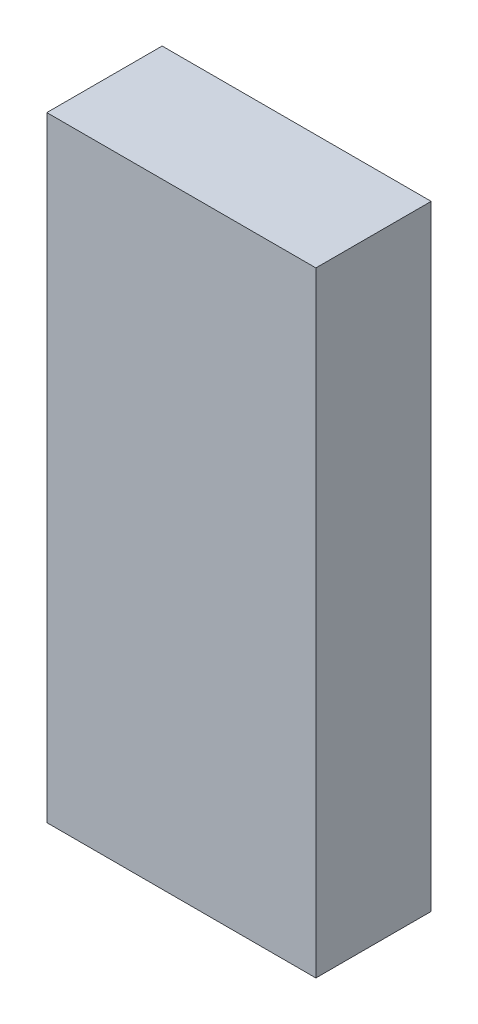
ISO-10303-21;
HEADER;
FILE_DESCRIPTION(('STEP AP214'),'2;1');
FILE_NAME('part.step','',(''),(''),'','','');
FILE_SCHEMA(('AUTOMOTIVE_DESIGN { 1 0 10303 214 1 1 1 1 }'));
ENDSEC;
DATA;
#1=APPLICATION_CONTEXT('core data for automotive mechanical design processes');
#2=APPLICATION_PROTOCOL_DEFINITION('international standard','automotive_design',2000,#1);
#3=PRODUCT_CONTEXT('',#1,'mechanical');
#4=PRODUCT('Part','Part','',(#3));
#5=PRODUCT_RELATED_PRODUCT_CATEGORY('part','',(#4));
#6=PRODUCT_DEFINITION_FORMATION('','',#4);
#7=PRODUCT_DEFINITION_CONTEXT('part definition',#1,'design');
#8=PRODUCT_DEFINITION('design','',#6,#7);
#9=PRODUCT_DEFINITION_SHAPE('','',#8);
#10=(LENGTH_UNIT() NAMED_UNIT(*) SI_UNIT(.MILLI.,.METRE.));
#11=(NAMED_UNIT(*) PLANE_ANGLE_UNIT() SI_UNIT($,.RADIAN.));
#12=(NAMED_UNIT(*) SI_UNIT($,.STERADIAN.) SOLID_ANGLE_UNIT());
#13=UNCERTAINTY_MEASURE_WITH_UNIT(LENGTH_MEASURE(1.E-05),#10,'distance_accuracy_value','');
#14=(GEOMETRIC_REPRESENTATION_CONTEXT(3) GLOBAL_UNCERTAINTY_ASSIGNED_CONTEXT((#13)) GLOBAL_UNIT_ASSIGNED_CONTEXT((#10,
#11,#12)) REPRESENTATION_CONTEXT('',''));
#15=CARTESIAN_POINT('',(0.,0.,0.));
#16=DIRECTION('',(0.,0.,1.));
#17=DIRECTION('',(1.,0.,0.));
#18=AXIS2_PLACEMENT_3D('',#15,#16,#17);
#19=CARTESIAN_POINT('',(0.,203.2,0.));
#20=DIRECTION('',(1.,0.,0.));
#21=DIRECTION('',(0.,0.,-1.));
#22=AXIS2_PLACEMENT_3D('',#19,#20,#21);
#23=PLANE('',#22);
#24=DIRECTION('',(0.,0.,1.));
#25=VECTOR('',#24,1.);
#26=CARTESIAN_POINT('',(0.,0.,0.));
#27=LINE('',#26,#25);
#28=CARTESIAN_POINT('',(0.,0.,-38.1));
#29=VERTEX_POINT('',#28);
#30=CARTESIAN_POINT('',(0.,0.,0.));
#31=VERTEX_POINT('',#30);
#32=EDGE_CURVE('E96',#29,#31,#27,.T.);
#33=ORIENTED_EDGE('',*,*,#32,.T.);
#34=DIRECTION('',(0.,-1.,0.));
#35=VECTOR('',#34,1.);
#36=CARTESIAN_POINT('',(0.,203.2,0.));
#37=LINE('',#36,#35);
#38=CARTESIAN_POINT('',(0.,203.2,0.));
#39=VERTEX_POINT('',#38);
#40=EDGE_CURVE('E11',#39,#31,#37,.T.);
#41=ORIENTED_EDGE('',*,*,#40,.F.);
#42=DIRECTION('',(0.,0.,1.));
#43=VECTOR('',#42,1.);
#44=CARTESIAN_POINT('',(0.,203.2,0.));
#45=LINE('',#44,#43);
#46=CARTESIAN_POINT('',(0.,203.2,-38.1));
#47=VERTEX_POINT('',#46);
#48=EDGE_CURVE('E84',#47,#39,#45,.T.);
#49=ORIENTED_EDGE('',*,*,#48,.F.);
#50=DIRECTION('',(0.,-1.,0.));
#51=VECTOR('',#50,1.);
#52=CARTESIAN_POINT('',(0.,203.2,-38.1));
#53=LINE('',#52,#51);
#54=EDGE_CURVE('E92',#47,#29,#53,.T.);
#55=ORIENTED_EDGE('',*,*,#54,.T.);
#56=EDGE_LOOP('',(#33,#41,#49,#55));
#57=FACE_BOUND('',#56,.T.);
#58=ADVANCED_FACE('F33',(#57),#23,.F.);
#59=CARTESIAN_POINT('',(0.,203.2,0.));
#60=DIRECTION('',(0.,0.,-1.));
#61=DIRECTION('',(-1.,0.,0.));
#62=AXIS2_PLACEMENT_3D('',#59,#60,#61);
#63=PLANE('',#62);
#64=DIRECTION('',(1.,0.,0.));
#65=VECTOR('',#64,1.);
#66=CARTESIAN_POINT('',(0.,0.,0.));
#67=LINE('',#66,#65);
#68=CARTESIAN_POINT('',(88.9,0.,0.));
#69=VERTEX_POINT('',#68);
#70=EDGE_CURVE('E88',#31,#69,#67,.T.);
#71=ORIENTED_EDGE('',*,*,#70,.T.);
#72=DIRECTION('',(0.,-1.,0.));
#73=VECTOR('',#72,1.);
#74=CARTESIAN_POINT('',(88.9,203.2,0.));
#75=LINE('',#74,#73);
#76=CARTESIAN_POINT('',(88.9,203.2,0.));
#77=VERTEX_POINT('',#76);
#78=EDGE_CURVE('E41',#77,#69,#75,.T.);
#79=ORIENTED_EDGE('',*,*,#78,.F.);
#80=DIRECTION('',(1.,0.,0.));
#81=VECTOR('',#80,1.);
#82=CARTESIAN_POINT('',(0.,203.2,0.));
#83=LINE('',#82,#81);
#84=EDGE_CURVE('E79',#39,#77,#83,.T.);
#85=ORIENTED_EDGE('',*,*,#84,.F.);
#86=ORIENTED_EDGE('',*,*,#40,.T.);
#87=EDGE_LOOP('',(#71,#79,#85,#86));
#88=FACE_BOUND('',#87,.T.);
#89=ADVANCED_FACE('F87',(#88),#63,.F.);
#90=CARTESIAN_POINT('',(88.9,203.2,0.));
#91=DIRECTION('',(-1.,0.,0.));
#92=DIRECTION('',(0.,0.,1.));
#93=AXIS2_PLACEMENT_3D('',#90,#91,#92);
#94=PLANE('',#93);
#95=DIRECTION('',(0.,0.,-1.));
#96=VECTOR('',#95,1.);
#97=CARTESIAN_POINT('',(88.9,0.,0.));
#98=LINE('',#97,#96);
#99=CARTESIAN_POINT('',(88.9,0.,-38.1));
#100=VERTEX_POINT('',#99);
#101=EDGE_CURVE('E66',#69,#100,#98,.T.);
#102=ORIENTED_EDGE('',*,*,#101,.T.);
#103=DIRECTION('',(0.,-1.,0.));
#104=VECTOR('',#103,1.);
#105=CARTESIAN_POINT('',(88.9,203.2,-38.1));
#106=LINE('',#105,#104);
#107=CARTESIAN_POINT('',(88.9,203.2,-38.1));
#108=VERTEX_POINT('',#107);
#109=EDGE_CURVE('E89',#108,#100,#106,.T.);
#110=ORIENTED_EDGE('',*,*,#109,.F.);
#111=DIRECTION('',(0.,0.,-1.));
#112=VECTOR('',#111,1.);
#113=CARTESIAN_POINT('',(88.9,203.2,0.));
#114=LINE('',#113,#112);
#115=EDGE_CURVE('E82',#77,#108,#114,.T.);
#116=ORIENTED_EDGE('',*,*,#115,.F.);
#117=ORIENTED_EDGE('',*,*,#78,.T.);
#118=EDGE_LOOP('',(#102,#110,#116,#117));
#119=FACE_BOUND('',#118,.T.);
#120=ADVANCED_FACE('F90',(#119),#94,.F.);
#121=CARTESIAN_POINT('',(0.,203.2,-38.1));
#122=DIRECTION('',(0.,0.,1.));
#123=DIRECTION('',(1.,0.,0.));
#124=AXIS2_PLACEMENT_3D('',#121,#122,#123);
#125=PLANE('',#124);
#126=DIRECTION('',(-1.,0.,0.));
#127=VECTOR('',#126,1.);
#128=CARTESIAN_POINT('',(0.,0.,-38.1));
#129=LINE('',#128,#127);
#130=EDGE_CURVE('E72',#100,#29,#129,.T.);
#131=ORIENTED_EDGE('',*,*,#130,.T.);
#132=ORIENTED_EDGE('',*,*,#54,.F.);
#133=DIRECTION('',(-1.,0.,0.));
#134=VECTOR('',#133,1.);
#135=CARTESIAN_POINT('',(0.,203.2,-38.1));
#136=LINE('',#135,#134);
#137=EDGE_CURVE('E49',#108,#47,#136,.T.);
#138=ORIENTED_EDGE('',*,*,#137,.F.);
#139=ORIENTED_EDGE('',*,*,#109,.T.);
#140=EDGE_LOOP('',(#131,#132,#138,#139));
#141=FACE_BOUND('',#140,.T.);
#142=ADVANCED_FACE('F103',(#141),#125,.F.);
#143=CARTESIAN_POINT('',(0.,203.2,0.));
#144=DIRECTION('',(0.,-1.,0.));
#145=DIRECTION('',(0.,0.,-1.));
#146=AXIS2_PLACEMENT_3D('',#143,#144,#145);
#147=PLANE('',#146);
#148=ORIENTED_EDGE('',*,*,#48,.T.);
#149=ORIENTED_EDGE('',*,*,#84,.T.);
#150=ORIENTED_EDGE('',*,*,#115,.T.);
#151=ORIENTED_EDGE('',*,*,#137,.T.);
#152=EDGE_LOOP('',(#148,#149,#150,#151));
#153=FACE_BOUND('',#152,.T.);
#154=ADVANCED_FACE('F80',(#153),#147,.F.);
#155=CARTESIAN_POINT('',(0.,0.,0.));
#156=DIRECTION('',(0.,-1.,0.));
#157=DIRECTION('',(0.,0.,-1.));
#158=AXIS2_PLACEMENT_3D('',#155,#156,#157);
#159=PLANE('',#158);
#160=ORIENTED_EDGE('',*,*,#32,.F.);
#161=ORIENTED_EDGE('',*,*,#130,.F.);
#162=ORIENTED_EDGE('',*,*,#101,.F.);
#163=ORIENTED_EDGE('',*,*,#70,.F.);
#164=EDGE_LOOP('',(#160,#161,#162,#163));
#165=FACE_BOUND('',#164,.T.);
#166=ADVANCED_FACE('F106',(#165),#159,.T.);
#167=CLOSED_SHELL('',(#58,#89,#120,#142,#154,#166));
#168=MANIFOLD_SOLID_BREP('B2',#167);
#169=ADVANCED_BREP_SHAPE_REPRESENTATION('',(#18,#168),#14);
#170=SHAPE_DEFINITION_REPRESENTATION(#9,#169);
ENDSEC;
END-ISO-10303-21;
